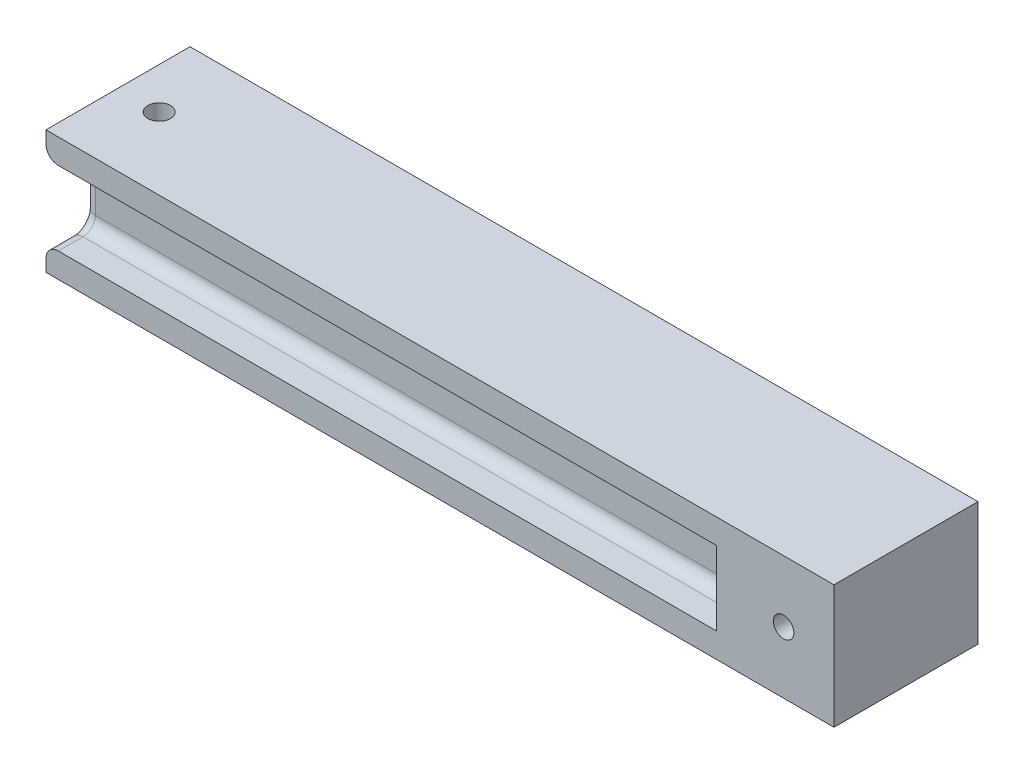
ISO-10303-21;
HEADER;
FILE_DESCRIPTION(('STEP AP214'),'2;1');
FILE_NAME('part.step','',(''),(''),'','','');
FILE_SCHEMA(('AUTOMOTIVE_DESIGN { 1 0 10303 214 1 1 1 1 }'));
ENDSEC;
DATA;
#1=APPLICATION_CONTEXT('core data for automotive mechanical design processes');
#2=APPLICATION_PROTOCOL_DEFINITION('international standard','automotive_design',2000,#1);
#3=PRODUCT_CONTEXT('',#1,'mechanical');
#4=PRODUCT('Part','Part','',(#3));
#5=PRODUCT_RELATED_PRODUCT_CATEGORY('part','',(#4));
#6=PRODUCT_DEFINITION_FORMATION('','',#4);
#7=PRODUCT_DEFINITION_CONTEXT('part definition',#1,'design');
#8=PRODUCT_DEFINITION('design','',#6,#7);
#9=PRODUCT_DEFINITION_SHAPE('','',#8);
#10=(LENGTH_UNIT() NAMED_UNIT(*) SI_UNIT(.MILLI.,.METRE.));
#11=(NAMED_UNIT(*) PLANE_ANGLE_UNIT() SI_UNIT($,.RADIAN.));
#12=(NAMED_UNIT(*) SI_UNIT($,.STERADIAN.) SOLID_ANGLE_UNIT());
#13=UNCERTAINTY_MEASURE_WITH_UNIT(LENGTH_MEASURE(1.E-05),#10,'distance_accuracy_value','');
#14=(GEOMETRIC_REPRESENTATION_CONTEXT(3) GLOBAL_UNCERTAINTY_ASSIGNED_CONTEXT((#13)) GLOBAL_UNIT_ASSIGNED_CONTEXT((#10,
#11,#12)) REPRESENTATION_CONTEXT('',''));
#15=CARTESIAN_POINT('',(0.,0.,0.));
#16=DIRECTION('',(0.,0.,1.));
#17=DIRECTION('',(1.,0.,0.));
#18=AXIS2_PLACEMENT_3D('',#15,#16,#17);
#19=CARTESIAN_POINT('',(-247.,30.,17.5));
#20=DIRECTION('',(-1.,0.,0.));
#21=DIRECTION('',(0.,0.,1.));
#22=AXIS2_PLACEMENT_3D('',#19,#20,#21);
#23=PLANE('',#22);
#24=CARTESIAN_POINT('',(-247.,21.,11.5));
#25=DIRECTION('',(-1.,0.,0.));
#26=DIRECTION('',(0.,0.,1.));
#27=AXIS2_PLACEMENT_3D('',#24,#25,#26);
#28=CIRCLE('',#27,6.);
#29=CARTESIAN_POINT('',(-247.,27.,11.5));
#30=VERTEX_POINT('',#29);
#31=CARTESIAN_POINT('',(-247.,21.,5.5));
#32=VERTEX_POINT('',#31);
#33=EDGE_CURVE('E364',#30,#32,#28,.T.);
#34=ORIENTED_EDGE('',*,*,#33,.F.);
#35=DIRECTION('',(0.,0.,1.));
#36=VECTOR('',#35,1.);
#37=CARTESIAN_POINT('',(-247.,27.,17.5));
#38=LINE('',#37,#36);
#39=CARTESIAN_POINT('',(-247.,27.,17.5));
#40=VERTEX_POINT('',#39);
#41=EDGE_CURVE('E374',#30,#40,#38,.T.);
#42=ORIENTED_EDGE('',*,*,#41,.T.);
#43=DIRECTION('',(0.,-1.,0.));
#44=VECTOR('',#43,1.);
#45=CARTESIAN_POINT('',(-247.,30.,17.5));
#46=LINE('',#45,#44);
#47=CARTESIAN_POINT('',(-247.,30.,17.5));
#48=VERTEX_POINT('',#47);
#49=EDGE_CURVE('E330',#48,#40,#46,.T.);
#50=ORIENTED_EDGE('',*,*,#49,.F.);
#51=DIRECTION('',(0.,0.,-1.));
#52=VECTOR('',#51,1.);
#53=CARTESIAN_POINT('',(-247.,30.,17.5));
#54=LINE('',#53,#52);
#55=CARTESIAN_POINT('',(-247.,30.,-17.5));
#56=VERTEX_POINT('',#55);
#57=EDGE_CURVE('E316',#48,#56,#54,.T.);
#58=ORIENTED_EDGE('',*,*,#57,.T.);
#59=DIRECTION('',(0.,-1.,0.));
#60=VECTOR('',#59,1.);
#61=CARTESIAN_POINT('',(-247.,30.,-17.5));
#62=LINE('',#61,#60);
#63=CARTESIAN_POINT('',(-247.,27.,-17.5));
#64=VERTEX_POINT('',#63);
#65=EDGE_CURVE('E335',#56,#64,#62,.T.);
#66=ORIENTED_EDGE('',*,*,#65,.T.);
#67=DIRECTION('',(0.,0.,1.));
#68=VECTOR('',#67,1.);
#69=CARTESIAN_POINT('',(-247.,27.,17.5));
#70=LINE('',#69,#68);
#71=CARTESIAN_POINT('',(-247.,27.,-11.5));
#72=VERTEX_POINT('',#71);
#73=EDGE_CURVE('E359',#64,#72,#70,.T.);
#74=ORIENTED_EDGE('',*,*,#73,.T.);
#75=CARTESIAN_POINT('',(-247.,21.,-11.5));
#76=DIRECTION('',(-1.,0.,0.));
#77=DIRECTION('',(0.,0.,1.));
#78=AXIS2_PLACEMENT_3D('',#75,#76,#77);
#79=CIRCLE('',#78,6.);
#80=CARTESIAN_POINT('',(-247.,21.,-5.5));
#81=VERTEX_POINT('',#80);
#82=EDGE_CURVE('E356',#81,#72,#79,.T.);
#83=ORIENTED_EDGE('',*,*,#82,.F.);
#84=DIRECTION('',(0.,-1.,0.));
#85=VECTOR('',#84,1.);
#86=CARTESIAN_POINT('',(-247.,30.,-5.50000000000001));
#87=LINE('',#86,#85);
#88=CARTESIAN_POINT('',(-247.,9.,-5.5));
#89=VERTEX_POINT('',#88);
#90=EDGE_CURVE('E354',#81,#89,#87,.T.);
#91=ORIENTED_EDGE('',*,*,#90,.T.);
#92=CARTESIAN_POINT('',(-247.,9.,-11.5));
#93=DIRECTION('',(-1.,0.,0.));
#94=DIRECTION('',(0.,0.,1.));
#95=AXIS2_PLACEMENT_3D('',#92,#93,#94);
#96=CIRCLE('',#95,6.);
#97=CARTESIAN_POINT('',(-247.,3.,-11.5));
#98=VERTEX_POINT('',#97);
#99=EDGE_CURVE('E341',#98,#89,#96,.T.);
#100=ORIENTED_EDGE('',*,*,#99,.F.);
#101=DIRECTION('',(0.,0.,-1.));
#102=VECTOR('',#101,1.);
#103=CARTESIAN_POINT('',(-247.,3.,17.5));
#104=LINE('',#103,#102);
#105=CARTESIAN_POINT('',(-247.,3.,-17.5));
#106=VERTEX_POINT('',#105);
#107=EDGE_CURVE('E361',#98,#106,#104,.T.);
#108=ORIENTED_EDGE('',*,*,#107,.T.);
#109=CARTESIAN_POINT('',(-247.,0.,-17.5));
#110=VERTEX_POINT('',#109);
#111=EDGE_CURVE('E324',#106,#110,#62,.T.);
#112=ORIENTED_EDGE('',*,*,#111,.T.);
#113=DIRECTION('',(0.,0.,-1.));
#114=VECTOR('',#113,1.);
#115=CARTESIAN_POINT('',(-247.,0.,17.5));
#116=LINE('',#115,#114);
#117=CARTESIAN_POINT('',(-247.,0.,17.5));
#118=VERTEX_POINT('',#117);
#119=EDGE_CURVE('E315',#118,#110,#116,.T.);
#120=ORIENTED_EDGE('',*,*,#119,.F.);
#121=CARTESIAN_POINT('',(-247.,3.,17.5));
#122=VERTEX_POINT('',#121);
#123=EDGE_CURVE('E334',#122,#118,#46,.T.);
#124=ORIENTED_EDGE('',*,*,#123,.F.);
#125=DIRECTION('',(0.,0.,-1.));
#126=VECTOR('',#125,1.);
#127=CARTESIAN_POINT('',(-247.,3.,17.5));
#128=LINE('',#127,#126);
#129=CARTESIAN_POINT('',(-247.,3.,11.5));
#130=VERTEX_POINT('',#129);
#131=EDGE_CURVE('E372',#122,#130,#128,.T.);
#132=ORIENTED_EDGE('',*,*,#131,.T.);
#133=CARTESIAN_POINT('',(-247.,9.,11.5));
#134=DIRECTION('',(-1.,0.,0.));
#135=DIRECTION('',(0.,0.,1.));
#136=AXIS2_PLACEMENT_3D('',#133,#134,#135);
#137=CIRCLE('',#136,6.);
#138=CARTESIAN_POINT('',(-247.,9.,5.5));
#139=VERTEX_POINT('',#138);
#140=EDGE_CURVE('E369',#139,#130,#137,.T.);
#141=ORIENTED_EDGE('',*,*,#140,.F.);
#142=DIRECTION('',(0.,1.,0.));
#143=VECTOR('',#142,1.);
#144=CARTESIAN_POINT('',(-247.,30.,5.5));
#145=LINE('',#144,#143);
#146=EDGE_CURVE('E367',#139,#32,#145,.T.);
#147=ORIENTED_EDGE('',*,*,#146,.T.);
#148=EDGE_LOOP('',(#34,#42,#50,#58,#66,#74,#83,#91,#100,#108,#112,#120,#124,#132,#141,#147));
#149=FACE_BOUND('',#148,.T.);
#150=ADVANCED_FACE('F33',(#149),#23,.T.);
#151=CARTESIAN_POINT('',(-247.,30.,17.5));
#152=DIRECTION('',(0.,0.,-1.));
#153=DIRECTION('',(-1.,0.,0.));
#154=AXIS2_PLACEMENT_3D('',#151,#152,#153);
#155=PLANE('',#154);
#156=ORIENTED_EDGE('',*,*,#49,.T.);
#157=CARTESIAN_POINT('',(-244.,27.,17.5));
#158=DIRECTION('',(0.,0.,-1.));
#159=DIRECTION('',(-1.,0.,0.));
#160=AXIS2_PLACEMENT_3D('',#157,#158,#159);
#161=CIRCLE('',#160,3.);
#162=CARTESIAN_POINT('',(-244.,24.,17.5));
#163=VERTEX_POINT('',#162);
#164=EDGE_CURVE('E379',#40,#163,#161,.F.);
#165=ORIENTED_EDGE('',*,*,#164,.T.);
#166=DIRECTION('',(-1.,0.,0.));
#167=VECTOR('',#166,1.);
#168=CARTESIAN_POINT('',(-84.,24.,17.5));
#169=LINE('',#168,#167);
#170=CARTESIAN_POINT('',(-84.,24.,17.5));
#171=VERTEX_POINT('',#170);
#172=EDGE_CURVE('E240',#171,#163,#169,.T.);
#173=ORIENTED_EDGE('',*,*,#172,.F.);
#174=DIRECTION('',(0.,1.,0.));
#175=VECTOR('',#174,1.);
#176=CARTESIAN_POINT('',(-84.,30.,17.5));
#177=LINE('',#176,#175);
#178=CARTESIAN_POINT('',(-84.,6.,17.5));
#179=VERTEX_POINT('',#178);
#180=EDGE_CURVE('E239',#179,#171,#177,.T.);
#181=ORIENTED_EDGE('',*,*,#180,.F.);
#182=DIRECTION('',(-1.,0.,0.));
#183=VECTOR('',#182,1.);
#184=CARTESIAN_POINT('',(-84.,6.,17.5));
#185=LINE('',#184,#183);
#186=CARTESIAN_POINT('',(-244.,6.,17.5));
#187=VERTEX_POINT('',#186);
#188=EDGE_CURVE('E246',#179,#187,#185,.T.);
#189=ORIENTED_EDGE('',*,*,#188,.T.);
#190=CARTESIAN_POINT('',(-244.,3.,17.5));
#191=DIRECTION('',(0.,0.,-1.));
#192=DIRECTION('',(-1.,0.,0.));
#193=AXIS2_PLACEMENT_3D('',#190,#191,#192);
#194=CIRCLE('',#193,3.);
#195=EDGE_CURVE('E377',#187,#122,#194,.F.);
#196=ORIENTED_EDGE('',*,*,#195,.T.);
#197=ORIENTED_EDGE('',*,*,#123,.T.);
#198=DIRECTION('',(1.,0.,0.));
#199=VECTOR('',#198,1.);
#200=CARTESIAN_POINT('',(-247.,0.,17.5));
#201=LINE('',#200,#199);
#202=CARTESIAN_POINT('',(-55.4989459475582,0.,17.5));
#203=VERTEX_POINT('',#202);
#204=EDGE_CURVE('E320',#118,#203,#201,.T.);
#205=ORIENTED_EDGE('',*,*,#204,.T.);
#206=DIRECTION('',(0.,1.,0.));
#207=VECTOR('',#206,1.);
#208=CARTESIAN_POINT('',(-55.4989459475582,30.,17.5));
#209=LINE('',#208,#207);
#210=CARTESIAN_POINT('',(-55.4989459475582,30.,17.5));
#211=VERTEX_POINT('',#210);
#212=EDGE_CURVE('E345',#203,#211,#209,.T.);
#213=ORIENTED_EDGE('',*,*,#212,.T.);
#214=DIRECTION('',(1.,0.,0.));
#215=VECTOR('',#214,1.);
#216=CARTESIAN_POINT('',(-247.,30.,17.5));
#217=LINE('',#216,#215);
#218=EDGE_CURVE('E322',#48,#211,#217,.T.);
#219=ORIENTED_EDGE('',*,*,#218,.F.);
#220=EDGE_LOOP('',(#156,#165,#173,#181,#189,#196,#197,#205,#213,#219));
#221=FACE_BOUND('',#220,.T.);
#222=CARTESIAN_POINT('',(-67.7461410245669,15.,17.5));
#223=DIRECTION('',(0.,0.,-1.));
#224=DIRECTION('',(-1.,0.,0.));
#225=AXIS2_PLACEMENT_3D('',#222,#223,#224);
#226=CIRCLE('',#225,2.50000000000001);
#227=CARTESIAN_POINT('',(-70.2461410245669,15.,17.5));
#228=VERTEX_POINT('',#227);
#229=EDGE_CURVE('E258',#228,#228,#226,.T.);
#230=ORIENTED_EDGE('',*,*,#229,.T.);
#231=EDGE_LOOP('',(#230));
#232=FACE_BOUND('',#231,.T.);
#233=ADVANCED_FACE('F521',(#221,#232),#155,.F.);
#234=CARTESIAN_POINT('',(-55.4989459475582,91.5559696739877,-40.0100000000001));
#235=DIRECTION('',(-1.,0.,0.));
#236=DIRECTION('',(0.,-1.,0.));
#237=AXIS2_PLACEMENT_3D('',#234,#235,#236);
#238=PLANE('',#237);
#239=ORIENTED_EDGE('',*,*,#212,.F.);
#240=DIRECTION('',(0.,0.,-1.));
#241=VECTOR('',#240,1.);
#242=CARTESIAN_POINT('',(-55.4989459475582,0.,0.));
#243=LINE('',#242,#241);
#244=CARTESIAN_POINT('',(-55.4989459475582,0.,-17.5));
#245=VERTEX_POINT('',#244);
#246=EDGE_CURVE('E338',#203,#245,#243,.T.);
#247=ORIENTED_EDGE('',*,*,#246,.T.);
#248=DIRECTION('',(0.,1.,0.));
#249=VECTOR('',#248,1.);
#250=CARTESIAN_POINT('',(-55.4989459475582,30.,-17.5));
#251=LINE('',#250,#249);
#252=CARTESIAN_POINT('',(-55.4989459475582,30.,-17.5));
#253=VERTEX_POINT('',#252);
#254=EDGE_CURVE('E342',#245,#253,#251,.T.);
#255=ORIENTED_EDGE('',*,*,#254,.T.);
#256=DIRECTION('',(0.,0.,-1.));
#257=VECTOR('',#256,1.);
#258=CARTESIAN_POINT('',(-55.4989459475582,30.,0.));
#259=LINE('',#258,#257);
#260=EDGE_CURVE('E333',#211,#253,#259,.T.);
#261=ORIENTED_EDGE('',*,*,#260,.F.);
#262=EDGE_LOOP('',(#239,#247,#255,#261));
#263=FACE_BOUND('',#262,.T.);
#264=ADVANCED_FACE('F484',(#263),#238,.F.);
#265=CARTESIAN_POINT('',(-247.,30.,-17.5));
#266=DIRECTION('',(0.,0.,-1.));
#267=DIRECTION('',(-1.,0.,0.));
#268=AXIS2_PLACEMENT_3D('',#265,#266,#267);
#269=PLANE('',#268);
#270=ORIENTED_EDGE('',*,*,#111,.F.);
#271=CARTESIAN_POINT('',(-244.,3.,-17.5));
#272=DIRECTION('',(0.,0.,-1.));
#273=DIRECTION('',(-1.,0.,0.));
#274=AXIS2_PLACEMENT_3D('',#271,#272,#273);
#275=CIRCLE('',#274,3.);
#276=CARTESIAN_POINT('',(-244.,6.,-17.5));
#277=VERTEX_POINT('',#276);
#278=EDGE_CURVE('E245',#106,#277,#275,.T.);
#279=ORIENTED_EDGE('',*,*,#278,.T.);
#280=DIRECTION('',(-1.,0.,0.));
#281=VECTOR('',#280,1.);
#282=CARTESIAN_POINT('',(-84.,6.,-17.5));
#283=LINE('',#282,#281);
#284=CARTESIAN_POINT('',(-84.,6.,-17.5));
#285=VERTEX_POINT('',#284);
#286=EDGE_CURVE('E223',#285,#277,#283,.T.);
#287=ORIENTED_EDGE('',*,*,#286,.F.);
#288=DIRECTION('',(0.,1.,0.));
#289=VECTOR('',#288,1.);
#290=CARTESIAN_POINT('',(-84.,30.,-17.5));
#291=LINE('',#290,#289);
#292=CARTESIAN_POINT('',(-84.,24.,-17.5));
#293=VERTEX_POINT('',#292);
#294=EDGE_CURVE('E233',#285,#293,#291,.T.);
#295=ORIENTED_EDGE('',*,*,#294,.T.);
#296=DIRECTION('',(-1.,0.,0.));
#297=VECTOR('',#296,1.);
#298=CARTESIAN_POINT('',(-84.,24.,-17.5));
#299=LINE('',#298,#297);
#300=CARTESIAN_POINT('',(-244.,24.,-17.5));
#301=VERTEX_POINT('',#300);
#302=EDGE_CURVE('E247',#293,#301,#299,.T.);
#303=ORIENTED_EDGE('',*,*,#302,.T.);
#304=CARTESIAN_POINT('',(-244.,27.,-17.5));
#305=DIRECTION('',(0.,0.,-1.));
#306=DIRECTION('',(-1.,0.,0.));
#307=AXIS2_PLACEMENT_3D('',#304,#305,#306);
#308=CIRCLE('',#307,3.);
#309=EDGE_CURVE('E389',#301,#64,#308,.T.);
#310=ORIENTED_EDGE('',*,*,#309,.T.);
#311=ORIENTED_EDGE('',*,*,#65,.F.);
#312=DIRECTION('',(1.,0.,0.));
#313=VECTOR('',#312,1.);
#314=CARTESIAN_POINT('',(-247.,30.,-17.5));
#315=LINE('',#314,#313);
#316=EDGE_CURVE('E319',#56,#253,#315,.T.);
#317=ORIENTED_EDGE('',*,*,#316,.T.);
#318=ORIENTED_EDGE('',*,*,#254,.F.);
#319=DIRECTION('',(1.,0.,0.));
#320=VECTOR('',#319,1.);
#321=CARTESIAN_POINT('',(-247.,0.,-17.5));
#322=LINE('',#321,#320);
#323=EDGE_CURVE('E327',#110,#245,#322,.T.);
#324=ORIENTED_EDGE('',*,*,#323,.F.);
#325=EDGE_LOOP('',(#270,#279,#287,#295,#303,#310,#311,#317,#318,#324));
#326=FACE_BOUND('',#325,.T.);
#327=CARTESIAN_POINT('',(-67.7461410245669,15.,-17.5));
#328=DIRECTION('',(0.,0.,-1.));
#329=DIRECTION('',(-1.,0.,0.));
#330=AXIS2_PLACEMENT_3D('',#327,#328,#329);
#331=CIRCLE('',#330,2.50000000000001);
#332=CARTESIAN_POINT('',(-70.2461410245669,15.,-17.5));
#333=VERTEX_POINT('',#332);
#334=EDGE_CURVE('E257',#333,#333,#331,.T.);
#335=ORIENTED_EDGE('',*,*,#334,.F.);
#336=EDGE_LOOP('',(#335));
#337=FACE_BOUND('',#336,.T.);
#338=ADVANCED_FACE('F243',(#326,#337),#269,.T.);
#339=CARTESIAN_POINT('',(0.,30.,0.));
#340=DIRECTION('',(0.,-1.,0.));
#341=DIRECTION('',(0.,0.,-1.));
#342=AXIS2_PLACEMENT_3D('',#339,#340,#341);
#343=PLANE('',#342);
#344=CARTESIAN_POINT('',(-237.,30.,0.));
#345=DIRECTION('',(0.,1.,0.));
#346=DIRECTION('',(0.,0.,1.));
#347=AXIS2_PLACEMENT_3D('',#344,#345,#346);
#348=CIRCLE('',#347,2.75000000000001);
#349=CARTESIAN_POINT('',(-237.,30.,2.75000000000001));
#350=VERTEX_POINT('',#349);
#351=EDGE_CURVE('E312',#350,#350,#348,.T.);
#352=ORIENTED_EDGE('',*,*,#351,.F.);
#353=EDGE_LOOP('',(#352));
#354=FACE_BOUND('',#353,.T.);
#355=ORIENTED_EDGE('',*,*,#218,.T.);
#356=ORIENTED_EDGE('',*,*,#260,.T.);
#357=ORIENTED_EDGE('',*,*,#316,.F.);
#358=ORIENTED_EDGE('',*,*,#57,.F.);
#359=EDGE_LOOP('',(#355,#356,#357,#358));
#360=FACE_BOUND('',#359,.T.);
#361=ADVANCED_FACE('F477',(#354,#360),#343,.F.);
#362=CARTESIAN_POINT('',(0.,0.,0.));
#363=DIRECTION('',(0.,-1.,0.));
#364=DIRECTION('',(0.,0.,-1.));
#365=AXIS2_PLACEMENT_3D('',#362,#363,#364);
#366=PLANE('',#365);
#367=ORIENTED_EDGE('',*,*,#323,.T.);
#368=ORIENTED_EDGE('',*,*,#246,.F.);
#369=ORIENTED_EDGE('',*,*,#204,.F.);
#370=ORIENTED_EDGE('',*,*,#119,.T.);
#371=EDGE_LOOP('',(#367,#368,#369,#370));
#372=FACE_BOUND('',#371,.T.);
#373=DIRECTION('',(-0.0469135489679844,0.,-0.998898953309707));
#374=VECTOR('',#373,1.);
#375=CARTESIAN_POINT('',(-241.130206963534,0.,2.650419546357));
#376=LINE('',#375,#374);
#377=CARTESIAN_POINT('',(-241.130206963534,0.,2.650419546357));
#378=VERTEX_POINT('',#377);
#379=CARTESIAN_POINT('',(-241.360434139599,0.,-2.25165438012909));
#380=VERTEX_POINT('',#379);
#381=EDGE_CURVE('E274',#378,#380,#376,.T.);
#382=ORIENTED_EDGE('',*,*,#381,.F.);
#383=DIRECTION('',(-0.888528643863882,0.,-0.458821151466898));
#384=VECTOR('',#383,1.);
#385=CARTESIAN_POINT('',(-236.769772823935,0.,4.90207392648608));
#386=LINE('',#385,#384);
#387=CARTESIAN_POINT('',(-236.769772823935,0.,4.90207392648608));
#388=VERTEX_POINT('',#387);
#389=EDGE_CURVE('E261',#388,#378,#386,.T.);
#390=ORIENTED_EDGE('',*,*,#389,.F.);
#391=DIRECTION('',(-0.841615094895903,0.,0.540077801842809));
#392=VECTOR('',#391,1.);
#393=CARTESIAN_POINT('',(-232.639565860401,0.,2.25165438012911));
#394=LINE('',#393,#392);
#395=CARTESIAN_POINT('',(-232.639565860401,0.,2.25165438012911));
#396=VERTEX_POINT('',#395);
#397=EDGE_CURVE('E262',#396,#388,#394,.T.);
#398=ORIENTED_EDGE('',*,*,#397,.F.);
#399=DIRECTION('',(0.0469135489679849,0.,0.998898953309707));
#400=VECTOR('',#399,1.);
#401=CARTESIAN_POINT('',(-232.869793036466,0.,-2.65041954635692));
#402=LINE('',#401,#400);
#403=CARTESIAN_POINT('',(-232.869793036466,0.,-2.65041954635692));
#404=VERTEX_POINT('',#403);
#405=EDGE_CURVE('E265',#404,#396,#402,.T.);
#406=ORIENTED_EDGE('',*,*,#405,.F.);
#407=DIRECTION('',(0.888528643863882,0.,0.458821151466898));
#408=VECTOR('',#407,1.);
#409=CARTESIAN_POINT('',(-237.230227176065,0.,-4.90207392648602));
#410=LINE('',#409,#408);
#411=CARTESIAN_POINT('',(-237.230227176065,0.,-4.90207392648602));
#412=VERTEX_POINT('',#411);
#413=EDGE_CURVE('E268',#412,#404,#410,.T.);
#414=ORIENTED_EDGE('',*,*,#413,.F.);
#415=DIRECTION('',(0.841615094895902,0.,-0.54007780184281));
#416=VECTOR('',#415,1.);
#417=CARTESIAN_POINT('',(-241.360434139599,0.,-2.25165438012909));
#418=LINE('',#417,#416);
#419=EDGE_CURVE('E271',#380,#412,#418,.T.);
#420=ORIENTED_EDGE('',*,*,#419,.F.);
#421=EDGE_LOOP('',(#382,#390,#398,#406,#414,#420));
#422=FACE_BOUND('',#421,.T.);
#423=ADVANCED_FACE('F487',(#372,#422),#366,.T.);
#424=CARTESIAN_POINT('',(-237.,21.,0.));
#425=DIRECTION('',(0.,1.,0.));
#426=DIRECTION('',(0.,0.,1.));
#427=AXIS2_PLACEMENT_3D('',#424,#425,#426);
#428=CYLINDRICAL_SURFACE('',#427,2.75000000000001);
#429=CARTESIAN_POINT('',(-237.,21.,0.));
#430=DIRECTION('',(0.,1.,0.));
#431=DIRECTION('',(0.,0.,1.));
#432=AXIS2_PLACEMENT_3D('',#429,#430,#431);
#433=CIRCLE('',#432,2.75000000000001);
#434=CARTESIAN_POINT('',(-237.,21.,2.75000000000001));
#435=VERTEX_POINT('',#434);
#436=EDGE_CURVE('E309',#435,#435,#433,.T.);
#437=ORIENTED_EDGE('',*,*,#436,.F.);
#438=EDGE_LOOP('',(#437));
#439=FACE_BOUND('',#438,.T.);
#440=ORIENTED_EDGE('',*,*,#351,.T.);
#441=EDGE_LOOP('',(#440));
#442=FACE_BOUND('',#441,.T.);
#443=ADVANCED_FACE('F761',(#439,#442),#428,.F.);
#444=CARTESIAN_POINT('',(-237.,21.,0.));
#445=DIRECTION('',(0.,1.,0.));
#446=DIRECTION('',(0.,0.,1.));
#447=AXIS2_PLACEMENT_3D('',#444,#445,#446);
#448=PLANE('',#447);
#449=ORIENTED_EDGE('',*,*,#436,.T.);
#450=EDGE_LOOP('',(#449));
#451=FACE_BOUND('',#450,.T.);
#452=DIRECTION('',(-0.888528643863882,0.,-0.458821151466898));
#453=VECTOR('',#452,1.);
#454=CARTESIAN_POINT('',(-236.769772823935,21.,4.90207392648608));
#455=LINE('',#454,#453);
#456=CARTESIAN_POINT('',(-236.769772823935,21.,4.90207392648608));
#457=VERTEX_POINT('',#456);
#458=CARTESIAN_POINT('',(-241.130206963534,21.,2.650419546357));
#459=VERTEX_POINT('',#458);
#460=EDGE_CURVE('E282',#457,#459,#455,.T.);
#461=ORIENTED_EDGE('',*,*,#460,.T.);
#462=DIRECTION('',(-0.0469135489679844,0.,-0.998898953309707));
#463=VECTOR('',#462,1.);
#464=CARTESIAN_POINT('',(-241.130206963534,21.,2.650419546357));
#465=LINE('',#464,#463);
#466=CARTESIAN_POINT('',(-241.360434139599,21.,-2.25165438012909));
#467=VERTEX_POINT('',#466);
#468=EDGE_CURVE('E264',#459,#467,#465,.T.);
#469=ORIENTED_EDGE('',*,*,#468,.T.);
#470=DIRECTION('',(0.841615094895902,0.,-0.54007780184281));
#471=VECTOR('',#470,1.);
#472=CARTESIAN_POINT('',(-241.360434139599,21.,-2.25165438012909));
#473=LINE('',#472,#471);
#474=CARTESIAN_POINT('',(-237.230227176065,21.,-4.90207392648602));
#475=VERTEX_POINT('',#474);
#476=EDGE_CURVE('E299',#467,#475,#473,.T.);
#477=ORIENTED_EDGE('',*,*,#476,.T.);
#478=DIRECTION('',(0.888528643863883,0.,0.458821151466898));
#479=VECTOR('',#478,1.);
#480=CARTESIAN_POINT('',(-237.230227176065,21.,-4.90207392648602));
#481=LINE('',#480,#479);
#482=CARTESIAN_POINT('',(-232.869793036466,21.,-2.65041954635692));
#483=VERTEX_POINT('',#482);
#484=EDGE_CURVE('E295',#475,#483,#481,.T.);
#485=ORIENTED_EDGE('',*,*,#484,.T.);
#486=DIRECTION('',(0.0469135489679849,0.,0.998898953309707));
#487=VECTOR('',#486,1.);
#488=CARTESIAN_POINT('',(-232.869793036466,21.,-2.65041954635692));
#489=LINE('',#488,#487);
#490=CARTESIAN_POINT('',(-232.639565860401,21.,2.25165438012911));
#491=VERTEX_POINT('',#490);
#492=EDGE_CURVE('E291',#483,#491,#489,.T.);
#493=ORIENTED_EDGE('',*,*,#492,.T.);
#494=DIRECTION('',(-0.841615094895903,0.,0.540077801842809));
#495=VECTOR('',#494,1.);
#496=CARTESIAN_POINT('',(-232.639565860401,21.,2.25165438012911));
#497=LINE('',#496,#495);
#498=EDGE_CURVE('E287',#491,#457,#497,.T.);
#499=ORIENTED_EDGE('',*,*,#498,.T.);
#500=EDGE_LOOP('',(#461,#469,#477,#485,#493,#499));
#501=FACE_BOUND('',#500,.T.);
#502=ADVANCED_FACE('F751',(#451,#501),#448,.F.);
#503=CARTESIAN_POINT('',(-241.130206963534,34.1215417793052,2.650419546357));
#504=DIRECTION('',(-0.998898953309707,0.,0.0469135489679844));
#505=DIRECTION('',(0.0469135489679844,0.,0.998898953309707));
#506=AXIS2_PLACEMENT_3D('',#503,#504,#505);
#507=PLANE('',#506);
#508=DIRECTION('',(0.,-1.,0.));
#509=VECTOR('',#508,1.);
#510=CARTESIAN_POINT('',(-241.130206963534,34.1215417793052,2.650419546357));
#511=LINE('',#510,#509);
#512=EDGE_CURVE('E285',#459,#378,#511,.T.);
#513=ORIENTED_EDGE('',*,*,#512,.T.);
#514=ORIENTED_EDGE('',*,*,#381,.T.);
#515=DIRECTION('',(0.,-1.,0.));
#516=VECTOR('',#515,1.);
#517=CARTESIAN_POINT('',(-241.360434139599,34.1215417793052,-2.25165438012909));
#518=LINE('',#517,#516);
#519=EDGE_CURVE('E281',#467,#380,#518,.T.);
#520=ORIENTED_EDGE('',*,*,#519,.F.);
#521=ORIENTED_EDGE('',*,*,#468,.F.);
#522=EDGE_LOOP('',(#513,#514,#520,#521));
#523=FACE_BOUND('',#522,.T.);
#524=ADVANCED_FACE('F741',(#523),#507,.F.);
#525=CARTESIAN_POINT('',(-241.360434139599,34.1215417793052,-2.25165438012909));
#526=DIRECTION('',(-0.54007780184281,0.,-0.841615094895902));
#527=DIRECTION('',(-0.841615094895902,0.,0.54007780184281));
#528=AXIS2_PLACEMENT_3D('',#525,#526,#527);
#529=PLANE('',#528);
#530=ORIENTED_EDGE('',*,*,#519,.T.);
#531=ORIENTED_EDGE('',*,*,#419,.T.);
#532=DIRECTION('',(0.,-1.,0.));
#533=VECTOR('',#532,1.);
#534=CARTESIAN_POINT('',(-237.230227176065,34.1215417793052,-4.90207392648602));
#535=LINE('',#534,#533);
#536=EDGE_CURVE('E298',#475,#412,#535,.T.);
#537=ORIENTED_EDGE('',*,*,#536,.F.);
#538=ORIENTED_EDGE('',*,*,#476,.F.);
#539=EDGE_LOOP('',(#530,#531,#537,#538));
#540=FACE_BOUND('',#539,.T.);
#541=ADVANCED_FACE('F731',(#540),#529,.F.);
#542=CARTESIAN_POINT('',(-237.230227176065,34.1215417793052,-4.90207392648602));
#543=DIRECTION('',(0.458821151466898,0.,-0.888528643863883));
#544=DIRECTION('',(-0.888528643863883,0.,-0.458821151466898));
#545=AXIS2_PLACEMENT_3D('',#542,#543,#544);
#546=PLANE('',#545);
#547=ORIENTED_EDGE('',*,*,#536,.T.);
#548=ORIENTED_EDGE('',*,*,#413,.T.);
#549=DIRECTION('',(0.,-1.,0.));
#550=VECTOR('',#549,1.);
#551=CARTESIAN_POINT('',(-232.869793036466,34.1215417793052,-2.65041954635692));
#552=LINE('',#551,#550);
#553=EDGE_CURVE('E294',#483,#404,#552,.T.);
#554=ORIENTED_EDGE('',*,*,#553,.F.);
#555=ORIENTED_EDGE('',*,*,#484,.F.);
#556=EDGE_LOOP('',(#547,#548,#554,#555));
#557=FACE_BOUND('',#556,.T.);
#558=ADVANCED_FACE('F721',(#557),#546,.F.);
#559=CARTESIAN_POINT('',(-232.869793036466,34.1215417793052,-2.65041954635692));
#560=DIRECTION('',(0.998898953309707,0.,-0.0469135489679849));
#561=DIRECTION('',(-0.0469135489679849,0.,-0.998898953309707));
#562=AXIS2_PLACEMENT_3D('',#559,#560,#561);
#563=PLANE('',#562);
#564=ORIENTED_EDGE('',*,*,#553,.T.);
#565=ORIENTED_EDGE('',*,*,#405,.T.);
#566=DIRECTION('',(0.,-1.,0.));
#567=VECTOR('',#566,1.);
#568=CARTESIAN_POINT('',(-232.639565860401,34.1215417793052,2.25165438012911));
#569=LINE('',#568,#567);
#570=EDGE_CURVE('E290',#491,#396,#569,.T.);
#571=ORIENTED_EDGE('',*,*,#570,.F.);
#572=ORIENTED_EDGE('',*,*,#492,.F.);
#573=EDGE_LOOP('',(#564,#565,#571,#572));
#574=FACE_BOUND('',#573,.T.);
#575=ADVANCED_FACE('F711',(#574),#563,.F.);
#576=CARTESIAN_POINT('',(-232.639565860401,34.1215417793052,2.25165438012911));
#577=DIRECTION('',(0.540077801842809,0.,0.841615094895903));
#578=DIRECTION('',(0.841615094895903,0.,-0.540077801842809));
#579=AXIS2_PLACEMENT_3D('',#576,#577,#578);
#580=PLANE('',#579);
#581=ORIENTED_EDGE('',*,*,#570,.T.);
#582=ORIENTED_EDGE('',*,*,#397,.T.);
#583=DIRECTION('',(0.,-1.,0.));
#584=VECTOR('',#583,1.);
#585=CARTESIAN_POINT('',(-236.769772823935,34.1215417793052,4.90207392648608));
#586=LINE('',#585,#584);
#587=EDGE_CURVE('E286',#457,#388,#586,.T.);
#588=ORIENTED_EDGE('',*,*,#587,.F.);
#589=ORIENTED_EDGE('',*,*,#498,.F.);
#590=EDGE_LOOP('',(#581,#582,#588,#589));
#591=FACE_BOUND('',#590,.T.);
#592=ADVANCED_FACE('F701',(#591),#580,.F.);
#593=CARTESIAN_POINT('',(-236.769772823935,34.1215417793052,4.90207392648608));
#594=DIRECTION('',(-0.458821151466898,0.,0.888528643863882));
#595=DIRECTION('',(0.888528643863882,0.,0.458821151466898));
#596=AXIS2_PLACEMENT_3D('',#593,#594,#595);
#597=PLANE('',#596);
#598=ORIENTED_EDGE('',*,*,#587,.T.);
#599=ORIENTED_EDGE('',*,*,#389,.T.);
#600=ORIENTED_EDGE('',*,*,#512,.F.);
#601=ORIENTED_EDGE('',*,*,#460,.F.);
#602=EDGE_LOOP('',(#598,#599,#600,#601));
#603=FACE_BOUND('',#602,.T.);
#604=ADVANCED_FACE('F532',(#603),#597,.F.);
#605=CARTESIAN_POINT('',(-67.7461410245669,15.,40.));
#606=DIRECTION('',(0.,0.,-1.));
#607=DIRECTION('',(-1.,0.,0.));
#608=AXIS2_PLACEMENT_3D('',#605,#606,#607);
#609=CYLINDRICAL_SURFACE('',#608,2.50000000000001);
#610=ORIENTED_EDGE('',*,*,#334,.T.);
#611=EDGE_LOOP('',(#610));
#612=FACE_BOUND('',#611,.T.);
#613=ORIENTED_EDGE('',*,*,#229,.F.);
#614=EDGE_LOOP('',(#613));
#615=FACE_BOUND('',#614,.T.);
#616=ADVANCED_FACE('F682',(#612,#615),#609,.F.);
#617=CARTESIAN_POINT('',(-84.,24.,-17.5));
#618=DIRECTION('',(0.,-1.,0.));
#619=DIRECTION('',(0.,0.,-1.));
#620=AXIS2_PLACEMENT_3D('',#617,#618,#619);
#621=PLANE('',#620);
#622=DIRECTION('',(-1.,0.,0.));
#623=VECTOR('',#622,1.);
#624=CARTESIAN_POINT('',(-247.,24.,-11.5));
#625=LINE('',#624,#623);
#626=CARTESIAN_POINT('',(-84.,24.,-11.5));
#627=VERTEX_POINT('',#626);
#628=CARTESIAN_POINT('',(-244.,24.,-11.5));
#629=VERTEX_POINT('',#628);
#630=EDGE_CURVE('E395',#627,#629,#625,.T.);
#631=ORIENTED_EDGE('',*,*,#630,.T.);
#632=DIRECTION('',(0.,0.,1.));
#633=VECTOR('',#632,1.);
#634=CARTESIAN_POINT('',(-244.,24.,-17.5));
#635=LINE('',#634,#633);
#636=EDGE_CURVE('E397',#629,#301,#635,.F.);
#637=ORIENTED_EDGE('',*,*,#636,.T.);
#638=ORIENTED_EDGE('',*,*,#302,.F.);
#639=DIRECTION('',(0.,0.,1.));
#640=VECTOR('',#639,1.);
#641=CARTESIAN_POINT('',(-84.,24.,-17.5));
#642=LINE('',#641,#640);
#643=EDGE_CURVE('E230',#293,#627,#642,.T.);
#644=ORIENTED_EDGE('',*,*,#643,.T.);
#645=EDGE_LOOP('',(#631,#637,#638,#644));
#646=FACE_BOUND('',#645,.T.);
#647=ADVANCED_FACE('F466',(#646),#621,.T.);
#648=CARTESIAN_POINT('',(-84.,6.,-8.5));
#649=DIRECTION('',(0.,1.,0.));
#650=DIRECTION('',(0.,0.,1.));
#651=AXIS2_PLACEMENT_3D('',#648,#649,#650);
#652=PLANE('',#651);
#653=ORIENTED_EDGE('',*,*,#286,.T.);
#654=DIRECTION('',(0.,0.,-1.));
#655=VECTOR('',#654,1.);
#656=CARTESIAN_POINT('',(-244.,6.,-8.5));
#657=LINE('',#656,#655);
#658=CARTESIAN_POINT('',(-244.,6.,-11.5));
#659=VERTEX_POINT('',#658);
#660=EDGE_CURVE('E393',#277,#659,#657,.F.);
#661=ORIENTED_EDGE('',*,*,#660,.T.);
#662=DIRECTION('',(-1.,0.,0.));
#663=VECTOR('',#662,1.);
#664=CARTESIAN_POINT('',(-84.,6.,-11.5));
#665=LINE('',#664,#663);
#666=CARTESIAN_POINT('',(-84.,6.,-11.5));
#667=VERTEX_POINT('',#666);
#668=EDGE_CURVE('E226',#659,#667,#665,.F.);
#669=ORIENTED_EDGE('',*,*,#668,.T.);
#670=DIRECTION('',(0.,0.,-1.));
#671=VECTOR('',#670,1.);
#672=CARTESIAN_POINT('',(-84.,6.,-8.5));
#673=LINE('',#672,#671);
#674=EDGE_CURVE('E219',#667,#285,#673,.T.);
#675=ORIENTED_EDGE('',*,*,#674,.T.);
#676=EDGE_LOOP('',(#653,#661,#669,#675));
#677=FACE_BOUND('',#676,.T.);
#678=ADVANCED_FACE('F221',(#677),#652,.T.);
#679=CARTESIAN_POINT('',(-84.,0.,0.));
#680=DIRECTION('',(-1.,0.,0.));
#681=DIRECTION('',(0.,0.,1.));
#682=AXIS2_PLACEMENT_3D('',#679,#680,#681);
#683=PLANE('',#682);
#684=ORIENTED_EDGE('',*,*,#674,.F.);
#685=DIRECTION('',(0.,-1.,0.));
#686=VECTOR('',#685,1.);
#687=CARTESIAN_POINT('',(-84.,24.,-11.5));
#688=LINE('',#687,#686);
#689=EDGE_CURVE('E11',#667,#627,#688,.F.);
#690=ORIENTED_EDGE('',*,*,#689,.T.);
#691=ORIENTED_EDGE('',*,*,#643,.F.);
#692=ORIENTED_EDGE('',*,*,#294,.F.);
#693=EDGE_LOOP('',(#684,#690,#691,#692));
#694=FACE_BOUND('',#693,.T.);
#695=ADVANCED_FACE('F234',(#694),#683,.T.);
#696=CARTESIAN_POINT('',(-84.,24.,-8.5));
#697=DIRECTION('',(0.,0.,-1.));
#698=DIRECTION('',(0.,1.,0.));
#699=AXIS2_PLACEMENT_3D('',#696,#697,#698);
#700=PLANE('',#699);
#701=DIRECTION('',(0.,-1.,0.));
#702=VECTOR('',#701,1.);
#703=CARTESIAN_POINT('',(-87.,6.,-8.5));
#704=LINE('',#703,#702);
#705=CARTESIAN_POINT('',(-87.,21.,-8.5));
#706=VERTEX_POINT('',#705);
#707=CARTESIAN_POINT('',(-87.,9.,-8.5));
#708=VERTEX_POINT('',#707);
#709=EDGE_CURVE('E50',#706,#708,#704,.T.);
#710=ORIENTED_EDGE('',*,*,#709,.T.);
#711=DIRECTION('',(-1.,0.,0.));
#712=VECTOR('',#711,1.);
#713=CARTESIAN_POINT('',(-247.,9.,-8.5));
#714=LINE('',#713,#712);
#715=CARTESIAN_POINT('',(-244.,9.,-8.5));
#716=VERTEX_POINT('',#715);
#717=EDGE_CURVE('E42',#708,#716,#714,.T.);
#718=ORIENTED_EDGE('',*,*,#717,.T.);
#719=DIRECTION('',(0.,-1.,0.));
#720=VECTOR('',#719,1.);
#721=CARTESIAN_POINT('',(-244.,24.,-8.5));
#722=LINE('',#721,#720);
#723=CARTESIAN_POINT('',(-244.,21.,-8.5));
#724=VERTEX_POINT('',#723);
#725=EDGE_CURVE('E410',#716,#724,#722,.F.);
#726=ORIENTED_EDGE('',*,*,#725,.T.);
#727=DIRECTION('',(-1.,0.,0.));
#728=VECTOR('',#727,1.);
#729=CARTESIAN_POINT('',(-84.,21.,-8.5));
#730=LINE('',#729,#728);
#731=EDGE_CURVE('E55',#724,#706,#730,.F.);
#732=ORIENTED_EDGE('',*,*,#731,.T.);
#733=EDGE_LOOP('',(#710,#718,#726,#732));
#734=FACE_BOUND('',#733,.T.);
#735=ADVANCED_FACE('F507',(#734),#700,.T.);
#736=DIRECTION('',(0.,0.,1.));
#737=VECTOR('',#736,1.);
#738=CARTESIAN_POINT('',(-84.,24.,8.5));
#739=LINE('',#738,#737);
#740=CARTESIAN_POINT('',(-84.,24.,11.5));
#741=VERTEX_POINT('',#740);
#742=EDGE_CURVE('E251',#741,#171,#739,.T.);
#743=ORIENTED_EDGE('',*,*,#742,.F.);
#744=DIRECTION('',(0.,1.,0.));
#745=VECTOR('',#744,1.);
#746=CARTESIAN_POINT('',(-84.,6.,11.5));
#747=LINE('',#746,#745);
#748=CARTESIAN_POINT('',(-84.,6.,11.5));
#749=VERTEX_POINT('',#748);
#750=EDGE_CURVE('E408',#741,#749,#747,.F.);
#751=ORIENTED_EDGE('',*,*,#750,.T.);
#752=DIRECTION('',(0.,0.,-1.));
#753=VECTOR('',#752,1.);
#754=CARTESIAN_POINT('',(-84.,6.,17.5));
#755=LINE('',#754,#753);
#756=EDGE_CURVE('E229',#179,#749,#755,.T.);
#757=ORIENTED_EDGE('',*,*,#756,.F.);
#758=ORIENTED_EDGE('',*,*,#180,.T.);
#759=EDGE_LOOP('',(#743,#751,#757,#758));
#760=FACE_BOUND('',#759,.T.);
#761=ADVANCED_FACE('F509',(#760),#683,.T.);
#762=CARTESIAN_POINT('',(-84.,24.,8.5));
#763=DIRECTION('',(0.,-1.,0.));
#764=DIRECTION('',(0.,0.,-1.));
#765=AXIS2_PLACEMENT_3D('',#762,#763,#764);
#766=PLANE('',#765);
#767=ORIENTED_EDGE('',*,*,#172,.T.);
#768=DIRECTION('',(0.,0.,1.));
#769=VECTOR('',#768,1.);
#770=CARTESIAN_POINT('',(-244.,24.,8.5));
#771=LINE('',#770,#769);
#772=CARTESIAN_POINT('',(-244.,24.,11.5));
#773=VERTEX_POINT('',#772);
#774=EDGE_CURVE('E383',#163,#773,#771,.F.);
#775=ORIENTED_EDGE('',*,*,#774,.T.);
#776=DIRECTION('',(-1.,0.,0.));
#777=VECTOR('',#776,1.);
#778=CARTESIAN_POINT('',(-84.,24.,11.5));
#779=LINE('',#778,#777);
#780=EDGE_CURVE('E381',#773,#741,#779,.F.);
#781=ORIENTED_EDGE('',*,*,#780,.T.);
#782=ORIENTED_EDGE('',*,*,#742,.T.);
#783=EDGE_LOOP('',(#767,#775,#781,#782));
#784=FACE_BOUND('',#783,.T.);
#785=ADVANCED_FACE('F515',(#784),#766,.T.);
#786=CARTESIAN_POINT('',(-84.,24.,8.5));
#787=DIRECTION('',(0.,0.,1.));
#788=DIRECTION('',(1.,0.,0.));
#789=AXIS2_PLACEMENT_3D('',#786,#787,#788);
#790=PLANE('',#789);
#791=DIRECTION('',(0.,1.,0.));
#792=VECTOR('',#791,1.);
#793=CARTESIAN_POINT('',(-87.,24.,8.5));
#794=LINE('',#793,#792);
#795=CARTESIAN_POINT('',(-87.,9.,8.5));
#796=VERTEX_POINT('',#795);
#797=CARTESIAN_POINT('',(-87.,21.,8.5));
#798=VERTEX_POINT('',#797);
#799=EDGE_CURVE('E403',#796,#798,#794,.T.);
#800=ORIENTED_EDGE('',*,*,#799,.T.);
#801=DIRECTION('',(-1.,0.,0.));
#802=VECTOR('',#801,1.);
#803=CARTESIAN_POINT('',(-247.,21.,8.5));
#804=LINE('',#803,#802);
#805=CARTESIAN_POINT('',(-244.,21.,8.5));
#806=VERTEX_POINT('',#805);
#807=EDGE_CURVE('E405',#798,#806,#804,.T.);
#808=ORIENTED_EDGE('',*,*,#807,.T.);
#809=DIRECTION('',(0.,1.,0.));
#810=VECTOR('',#809,1.);
#811=CARTESIAN_POINT('',(-244.,24.,8.5));
#812=LINE('',#811,#810);
#813=CARTESIAN_POINT('',(-244.,9.,8.5));
#814=VERTEX_POINT('',#813);
#815=EDGE_CURVE('E399',#806,#814,#812,.F.);
#816=ORIENTED_EDGE('',*,*,#815,.T.);
#817=DIRECTION('',(-1.,0.,0.));
#818=VECTOR('',#817,1.);
#819=CARTESIAN_POINT('',(-84.,9.,8.5));
#820=LINE('',#819,#818);
#821=EDGE_CURVE('E401',#814,#796,#820,.F.);
#822=ORIENTED_EDGE('',*,*,#821,.T.);
#823=EDGE_LOOP('',(#800,#808,#816,#822));
#824=FACE_BOUND('',#823,.T.);
#825=ADVANCED_FACE('F631',(#824),#790,.T.);
#826=CARTESIAN_POINT('',(-84.,6.,17.5));
#827=DIRECTION('',(0.,1.,0.));
#828=DIRECTION('',(0.,0.,1.));
#829=AXIS2_PLACEMENT_3D('',#826,#827,#828);
#830=PLANE('',#829);
#831=DIRECTION('',(-1.,0.,0.));
#832=VECTOR('',#831,1.);
#833=CARTESIAN_POINT('',(-247.,6.,11.5));
#834=LINE('',#833,#832);
#835=CARTESIAN_POINT('',(-244.,6.,11.5));
#836=VERTEX_POINT('',#835);
#837=EDGE_CURVE('E385',#749,#836,#834,.T.);
#838=ORIENTED_EDGE('',*,*,#837,.T.);
#839=DIRECTION('',(0.,0.,-1.));
#840=VECTOR('',#839,1.);
#841=CARTESIAN_POINT('',(-244.,6.,17.5));
#842=LINE('',#841,#840);
#843=EDGE_CURVE('E387',#836,#187,#842,.F.);
#844=ORIENTED_EDGE('',*,*,#843,.T.);
#845=ORIENTED_EDGE('',*,*,#188,.F.);
#846=ORIENTED_EDGE('',*,*,#756,.T.);
#847=EDGE_LOOP('',(#838,#844,#845,#846));
#848=FACE_BOUND('',#847,.T.);
#849=ADVANCED_FACE('F564',(#848),#830,.T.);
#850=CARTESIAN_POINT('',(-84.,9.,11.5));
#851=DIRECTION('',(1.,0.,0.));
#852=DIRECTION('',(0.,0.,-1.));
#853=AXIS2_PLACEMENT_3D('',#850,#851,#852);
#854=CYLINDRICAL_SURFACE('',#853,3.);
#855=CARTESIAN_POINT('',(-244.,9.,11.5));
#856=DIRECTION('',(-1.,0.,0.));
#857=DIRECTION('',(0.,0.,1.));
#858=AXIS2_PLACEMENT_3D('',#855,#856,#857);
#859=CIRCLE('',#858,3.);
#860=EDGE_CURVE('E432',#836,#814,#859,.F.);
#861=ORIENTED_EDGE('',*,*,#860,.F.);
#862=ORIENTED_EDGE('',*,*,#837,.F.);
#863=CARTESIAN_POINT('',(-87.,9.,11.5));
#864=DIRECTION('',(-0.707106781186547,-0.707106781186547,0.));
#865=DIRECTION('',(0.707106781186547,-0.707106781186547,0.));
#866=AXIS2_PLACEMENT_3D('',#863,#864,#865);
#867=ELLIPSE('',#866,4.24264068711928,3.);
#868=EDGE_CURVE('E435',#796,#749,#867,.T.);
#869=ORIENTED_EDGE('',*,*,#868,.F.);
#870=ORIENTED_EDGE('',*,*,#821,.F.);
#871=EDGE_LOOP('',(#861,#862,#869,#870));
#872=FACE_BOUND('',#871,.T.);
#873=ADVANCED_FACE('F560',(#872),#854,.F.);
#874=CARTESIAN_POINT('',(-244.,3.,17.5));
#875=DIRECTION('',(0.,0.,-1.));
#876=DIRECTION('',(-1.,0.,0.));
#877=AXIS2_PLACEMENT_3D('',#874,#875,#876);
#878=CYLINDRICAL_SURFACE('',#877,3.);
#879=ORIENTED_EDGE('',*,*,#195,.F.);
#880=ORIENTED_EDGE('',*,*,#843,.F.);
#881=CARTESIAN_POINT('',(-244.,3.,11.5));
#882=DIRECTION('',(0.,0.,-1.));
#883=DIRECTION('',(-1.,0.,0.));
#884=AXIS2_PLACEMENT_3D('',#881,#882,#883);
#885=CIRCLE('',#884,3.);
#886=EDGE_CURVE('E429',#130,#836,#885,.T.);
#887=ORIENTED_EDGE('',*,*,#886,.F.);
#888=ORIENTED_EDGE('',*,*,#131,.F.);
#889=EDGE_LOOP('',(#879,#880,#887,#888));
#890=FACE_BOUND('',#889,.T.);
#891=ADVANCED_FACE('F556',(#890),#878,.T.);
#892=CARTESIAN_POINT('',(-87.,24.,11.5));
#893=DIRECTION('',(0.,-1.,0.));
#894=DIRECTION('',(0.,0.,-1.));
#895=AXIS2_PLACEMENT_3D('',#892,#893,#894);
#896=CYLINDRICAL_SURFACE('',#895,3.);
#897=ORIENTED_EDGE('',*,*,#868,.T.);
#898=ORIENTED_EDGE('',*,*,#750,.F.);
#899=CARTESIAN_POINT('',(-87.,21.,11.5));
#900=DIRECTION('',(0.707106781186547,-0.707106781186547,0.));
#901=DIRECTION('',(0.707106781186547,0.707106781186547,0.));
#902=AXIS2_PLACEMENT_3D('',#899,#900,#901);
#903=ELLIPSE('',#902,4.24264068711928,3.);
#904=EDGE_CURVE('E426',#798,#741,#903,.T.);
#905=ORIENTED_EDGE('',*,*,#904,.F.);
#906=ORIENTED_EDGE('',*,*,#799,.F.);
#907=EDGE_LOOP('',(#897,#898,#905,#906));
#908=FACE_BOUND('',#907,.T.);
#909=ADVANCED_FACE('F552',(#908),#896,.F.);
#910=CARTESIAN_POINT('',(-244.,9.,11.5));
#911=DIRECTION('',(-1.,0.,0.));
#912=DIRECTION('',(0.,0.,1.));
#913=AXIS2_PLACEMENT_3D('',#910,#911,#912);
#914=TOROIDAL_SURFACE('',#913,6.,3.);
#915=ORIENTED_EDGE('',*,*,#886,.T.);
#916=ORIENTED_EDGE('',*,*,#860,.T.);
#917=CARTESIAN_POINT('',(-244.,9.,5.5));
#918=DIRECTION('',(0.,-1.,0.));
#919=DIRECTION('',(0.,0.,-1.));
#920=AXIS2_PLACEMENT_3D('',#917,#918,#919);
#921=CIRCLE('',#920,3.);
#922=EDGE_CURVE('E423',#139,#814,#921,.F.);
#923=ORIENTED_EDGE('',*,*,#922,.F.);
#924=ORIENTED_EDGE('',*,*,#140,.T.);
#925=EDGE_LOOP('',(#915,#916,#923,#924));
#926=FACE_BOUND('',#925,.T.);
#927=ADVANCED_FACE('F548',(#926),#914,.T.);
#928=CARTESIAN_POINT('',(-84.,21.,11.5));
#929=DIRECTION('',(1.,0.,0.));
#930=DIRECTION('',(0.,0.,-1.));
#931=AXIS2_PLACEMENT_3D('',#928,#929,#930);
#932=CYLINDRICAL_SURFACE('',#931,3.);
#933=ORIENTED_EDGE('',*,*,#904,.T.);
#934=ORIENTED_EDGE('',*,*,#780,.F.);
#935=CARTESIAN_POINT('',(-244.,21.,11.5));
#936=DIRECTION('',(-1.,0.,0.));
#937=DIRECTION('',(0.,0.,1.));
#938=AXIS2_PLACEMENT_3D('',#935,#936,#937);
#939=CIRCLE('',#938,3.);
#940=EDGE_CURVE('E420',#806,#773,#939,.F.);
#941=ORIENTED_EDGE('',*,*,#940,.F.);
#942=ORIENTED_EDGE('',*,*,#807,.F.);
#943=EDGE_LOOP('',(#933,#934,#941,#942));
#944=FACE_BOUND('',#943,.T.);
#945=ADVANCED_FACE('F544',(#944),#932,.F.);
#946=CARTESIAN_POINT('',(-244.,30.,5.5));
#947=DIRECTION('',(0.,1.,0.));
#948=DIRECTION('',(0.,0.,1.));
#949=AXIS2_PLACEMENT_3D('',#946,#947,#948);
#950=CYLINDRICAL_SURFACE('',#949,3.);
#951=ORIENTED_EDGE('',*,*,#922,.T.);
#952=ORIENTED_EDGE('',*,*,#815,.F.);
#953=CARTESIAN_POINT('',(-244.,21.,5.5));
#954=DIRECTION('',(0.,1.,0.));
#955=DIRECTION('',(0.,0.,1.));
#956=AXIS2_PLACEMENT_3D('',#953,#954,#955);
#957=CIRCLE('',#956,3.);
#958=EDGE_CURVE('E418',#32,#806,#957,.T.);
#959=ORIENTED_EDGE('',*,*,#958,.F.);
#960=ORIENTED_EDGE('',*,*,#146,.F.);
#961=EDGE_LOOP('',(#951,#952,#959,#960));
#962=FACE_BOUND('',#961,.T.);
#963=ADVANCED_FACE('F540',(#962),#950,.T.);
#964=CARTESIAN_POINT('',(-244.,21.,11.5));
#965=DIRECTION('',(-1.,0.,0.));
#966=DIRECTION('',(0.,0.,1.));
#967=AXIS2_PLACEMENT_3D('',#964,#965,#966);
#968=TOROIDAL_SURFACE('',#967,6.,3.);
#969=ORIENTED_EDGE('',*,*,#958,.T.);
#970=ORIENTED_EDGE('',*,*,#940,.T.);
#971=CARTESIAN_POINT('',(-244.,27.,11.5));
#972=DIRECTION('',(0.,0.,-1.));
#973=DIRECTION('',(-1.,0.,0.));
#974=AXIS2_PLACEMENT_3D('',#971,#972,#973);
#975=CIRCLE('',#974,3.);
#976=EDGE_CURVE('E415',#30,#773,#975,.F.);
#977=ORIENTED_EDGE('',*,*,#976,.F.);
#978=ORIENTED_EDGE('',*,*,#33,.T.);
#979=EDGE_LOOP('',(#969,#970,#977,#978));
#980=FACE_BOUND('',#979,.T.);
#981=ADVANCED_FACE('F536',(#980),#968,.T.);
#982=CARTESIAN_POINT('',(-244.,27.,17.5));
#983=DIRECTION('',(0.,0.,1.));
#984=DIRECTION('',(1.,0.,0.));
#985=AXIS2_PLACEMENT_3D('',#982,#983,#984);
#986=CYLINDRICAL_SURFACE('',#985,3.);
#987=ORIENTED_EDGE('',*,*,#976,.T.);
#988=ORIENTED_EDGE('',*,*,#774,.F.);
#989=ORIENTED_EDGE('',*,*,#164,.F.);
#990=ORIENTED_EDGE('',*,*,#41,.F.);
#991=EDGE_LOOP('',(#987,#988,#989,#990));
#992=FACE_BOUND('',#991,.T.);
#993=ADVANCED_FACE('F533',(#992),#986,.T.);
#994=CARTESIAN_POINT('',(-84.,21.,-11.5));
#995=DIRECTION('',(1.,0.,0.));
#996=DIRECTION('',(0.,0.,-1.));
#997=AXIS2_PLACEMENT_3D('',#994,#995,#996);
#998=CYLINDRICAL_SURFACE('',#997,3.);
#999=CARTESIAN_POINT('',(-244.,21.,-11.5));
#1000=DIRECTION('',(-1.,0.,0.));
#1001=DIRECTION('',(0.,0.,1.));
#1002=AXIS2_PLACEMENT_3D('',#999,#1000,#1001);
#1003=CIRCLE('',#1002,3.);
#1004=EDGE_CURVE('E454',#629,#724,#1003,.F.);
#1005=ORIENTED_EDGE('',*,*,#1004,.F.);
#1006=ORIENTED_EDGE('',*,*,#630,.F.);
#1007=CARTESIAN_POINT('',(-87.,21.,-11.5));
#1008=DIRECTION('',(-0.707106781186547,0.707106781186547,0.));
#1009=DIRECTION('',(0.707106781186547,0.707106781186547,0.));
#1010=AXIS2_PLACEMENT_3D('',#1007,#1008,#1009);
#1011=ELLIPSE('',#1010,4.24264068711928,3.);
#1012=EDGE_CURVE('E37',#706,#627,#1011,.T.);
#1013=ORIENTED_EDGE('',*,*,#1012,.F.);
#1014=ORIENTED_EDGE('',*,*,#731,.F.);
#1015=EDGE_LOOP('',(#1005,#1006,#1013,#1014));
#1016=FACE_BOUND('',#1015,.T.);
#1017=ADVANCED_FACE('F35',(#1016),#998,.F.);
#1018=CARTESIAN_POINT('',(-244.,27.,17.5));
#1019=DIRECTION('',(0.,0.,1.));
#1020=DIRECTION('',(0.,-1.,0.));
#1021=AXIS2_PLACEMENT_3D('',#1018,#1019,#1020);
#1022=CYLINDRICAL_SURFACE('',#1021,3.);
#1023=ORIENTED_EDGE('',*,*,#309,.F.);
#1024=ORIENTED_EDGE('',*,*,#636,.F.);
#1025=CARTESIAN_POINT('',(-244.,27.,-11.5));
#1026=DIRECTION('',(0.,0.,1.));
#1027=DIRECTION('',(0.,-1.,0.));
#1028=AXIS2_PLACEMENT_3D('',#1025,#1026,#1027);
#1029=CIRCLE('',#1028,3.);
#1030=EDGE_CURVE('E452',#72,#629,#1029,.T.);
#1031=ORIENTED_EDGE('',*,*,#1030,.F.);
#1032=ORIENTED_EDGE('',*,*,#73,.F.);
#1033=EDGE_LOOP('',(#1023,#1024,#1031,#1032));
#1034=FACE_BOUND('',#1033,.T.);
#1035=ADVANCED_FACE('F470',(#1034),#1022,.T.);
#1036=CARTESIAN_POINT('',(-87.,24.,-11.5));
#1037=DIRECTION('',(0.,1.,0.));
#1038=DIRECTION('',(0.,0.,1.));
#1039=AXIS2_PLACEMENT_3D('',#1036,#1037,#1038);
#1040=CYLINDRICAL_SURFACE('',#1039,3.);
#1041=ORIENTED_EDGE('',*,*,#1012,.T.);
#1042=ORIENTED_EDGE('',*,*,#689,.F.);
#1043=CARTESIAN_POINT('',(-87.,9.,-11.5));
#1044=DIRECTION('',(0.707106781186547,0.707106781186547,0.));
#1045=DIRECTION('',(0.707106781186547,-0.707106781186547,0.));
#1046=AXIS2_PLACEMENT_3D('',#1043,#1044,#1045);
#1047=ELLIPSE('',#1046,4.24264068711928,3.);
#1048=EDGE_CURVE('E449',#708,#667,#1047,.T.);
#1049=ORIENTED_EDGE('',*,*,#1048,.F.);
#1050=ORIENTED_EDGE('',*,*,#709,.F.);
#1051=EDGE_LOOP('',(#1041,#1042,#1049,#1050));
#1052=FACE_BOUND('',#1051,.T.);
#1053=ADVANCED_FACE('F461',(#1052),#1040,.F.);
#1054=CARTESIAN_POINT('',(-244.,21.,-11.5));
#1055=DIRECTION('',(-1.,0.,0.));
#1056=DIRECTION('',(0.,0.,1.));
#1057=AXIS2_PLACEMENT_3D('',#1054,#1055,#1056);
#1058=TOROIDAL_SURFACE('',#1057,6.,3.);
#1059=ORIENTED_EDGE('',*,*,#1030,.T.);
#1060=ORIENTED_EDGE('',*,*,#1004,.T.);
#1061=CARTESIAN_POINT('',(-244.,21.,-5.5));
#1062=DIRECTION('',(0.,1.,0.));
#1063=DIRECTION('',(0.,0.,1.));
#1064=AXIS2_PLACEMENT_3D('',#1061,#1062,#1063);
#1065=CIRCLE('',#1064,3.);
#1066=EDGE_CURVE('E446',#81,#724,#1065,.F.);
#1067=ORIENTED_EDGE('',*,*,#1066,.F.);
#1068=ORIENTED_EDGE('',*,*,#82,.T.);
#1069=EDGE_LOOP('',(#1059,#1060,#1067,#1068));
#1070=FACE_BOUND('',#1069,.T.);
#1071=ADVANCED_FACE('F574',(#1070),#1058,.T.);
#1072=CARTESIAN_POINT('',(-84.,9.,-11.5));
#1073=DIRECTION('',(1.,0.,0.));
#1074=DIRECTION('',(0.,0.,-1.));
#1075=AXIS2_PLACEMENT_3D('',#1072,#1073,#1074);
#1076=CYLINDRICAL_SURFACE('',#1075,3.);
#1077=ORIENTED_EDGE('',*,*,#1048,.T.);
#1078=ORIENTED_EDGE('',*,*,#668,.F.);
#1079=CARTESIAN_POINT('',(-244.,9.,-11.5));
#1080=DIRECTION('',(-1.,0.,0.));
#1081=DIRECTION('',(0.,0.,1.));
#1082=AXIS2_PLACEMENT_3D('',#1079,#1080,#1081);
#1083=CIRCLE('',#1082,3.);
#1084=EDGE_CURVE('E443',#716,#659,#1083,.F.);
#1085=ORIENTED_EDGE('',*,*,#1084,.F.);
#1086=ORIENTED_EDGE('',*,*,#717,.F.);
#1087=EDGE_LOOP('',(#1077,#1078,#1085,#1086));
#1088=FACE_BOUND('',#1087,.T.);
#1089=ADVANCED_FACE('F498',(#1088),#1076,.F.);
#1090=CARTESIAN_POINT('',(-244.,30.,-5.50000000000001));
#1091=DIRECTION('',(0.,-1.,0.));
#1092=DIRECTION('',(0.,0.,-1.));
#1093=AXIS2_PLACEMENT_3D('',#1090,#1091,#1092);
#1094=CYLINDRICAL_SURFACE('',#1093,3.);
#1095=ORIENTED_EDGE('',*,*,#1066,.T.);
#1096=ORIENTED_EDGE('',*,*,#725,.F.);
#1097=CARTESIAN_POINT('',(-244.,9.,-5.5));
#1098=DIRECTION('',(0.,-1.,0.));
#1099=DIRECTION('',(0.,0.,-1.));
#1100=AXIS2_PLACEMENT_3D('',#1097,#1098,#1099);
#1101=CIRCLE('',#1100,3.);
#1102=EDGE_CURVE('E441',#89,#716,#1101,.T.);
#1103=ORIENTED_EDGE('',*,*,#1102,.F.);
#1104=ORIENTED_EDGE('',*,*,#90,.F.);
#1105=EDGE_LOOP('',(#1095,#1096,#1103,#1104));
#1106=FACE_BOUND('',#1105,.T.);
#1107=ADVANCED_FACE('F506',(#1106),#1094,.T.);
#1108=CARTESIAN_POINT('',(-244.,9.,-11.5));
#1109=DIRECTION('',(-1.,0.,0.));
#1110=DIRECTION('',(0.,0.,1.));
#1111=AXIS2_PLACEMENT_3D('',#1108,#1109,#1110);
#1112=TOROIDAL_SURFACE('',#1111,6.,3.);
#1113=ORIENTED_EDGE('',*,*,#1102,.T.);
#1114=ORIENTED_EDGE('',*,*,#1084,.T.);
#1115=CARTESIAN_POINT('',(-244.,3.,-11.5));
#1116=DIRECTION('',(0.,0.,1.));
#1117=DIRECTION('',(1.,0.,0.));
#1118=AXIS2_PLACEMENT_3D('',#1115,#1116,#1117);
#1119=CIRCLE('',#1118,3.);
#1120=EDGE_CURVE('E438',#98,#659,#1119,.F.);
#1121=ORIENTED_EDGE('',*,*,#1120,.F.);
#1122=ORIENTED_EDGE('',*,*,#99,.T.);
#1123=EDGE_LOOP('',(#1113,#1114,#1121,#1122));
#1124=FACE_BOUND('',#1123,.T.);
#1125=ADVANCED_FACE('F502',(#1124),#1112,.T.);
#1126=CARTESIAN_POINT('',(-244.,3.,17.5));
#1127=DIRECTION('',(0.,0.,-1.));
#1128=DIRECTION('',(-1.,0.,0.));
#1129=AXIS2_PLACEMENT_3D('',#1126,#1127,#1128);
#1130=CYLINDRICAL_SURFACE('',#1129,3.);
#1131=ORIENTED_EDGE('',*,*,#1120,.T.);
#1132=ORIENTED_EDGE('',*,*,#660,.F.);
#1133=ORIENTED_EDGE('',*,*,#278,.F.);
#1134=ORIENTED_EDGE('',*,*,#107,.F.);
#1135=EDGE_LOOP('',(#1131,#1132,#1133,#1134));
#1136=FACE_BOUND('',#1135,.T.);
#1137=ADVANCED_FACE('F495',(#1136),#1130,.T.);
#1138=CLOSED_SHELL('',(#150,#233,#264,#338,#361,#423,#443,#502,#524,#541,#558,#575,#592,#604,
#616,#647,#678,#695,#735,#761,#785,#825,#849,#873,#891,#909,#927,#945,#963,#981,#993,#1017,
#1035,#1053,#1071,#1089,#1107,#1125,#1137));
#1139=MANIFOLD_SOLID_BREP('B2',#1138);
#1140=ADVANCED_BREP_SHAPE_REPRESENTATION('',(#18,#1139),#14);
#1141=SHAPE_DEFINITION_REPRESENTATION(#9,#1140);
ENDSEC;
END-ISO-10303-21;
